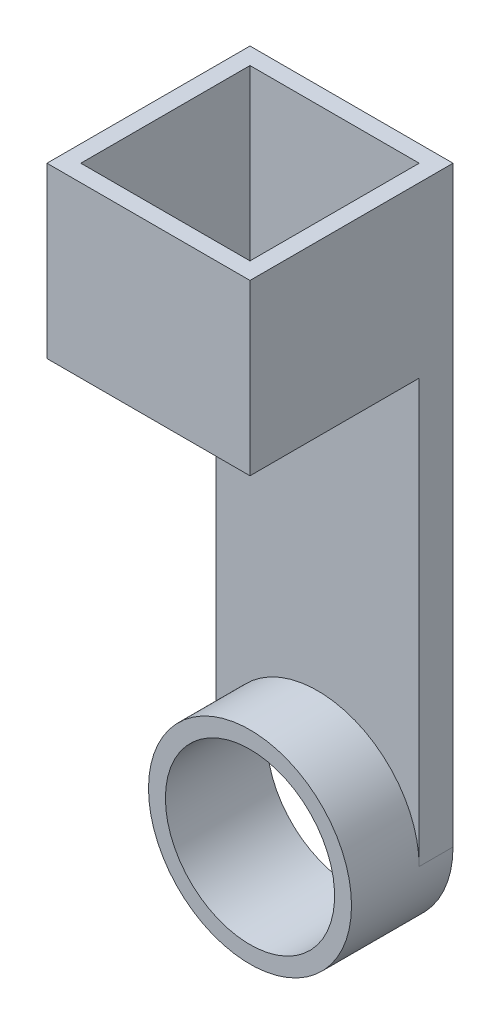
ISO-10303-21;
HEADER;
FILE_DESCRIPTION(('STEP AP214'),'2;1');
FILE_NAME('part.step','',(''),(''),'','','');
FILE_SCHEMA(('AUTOMOTIVE_DESIGN { 1 0 10303 214 1 1 1 1 }'));
ENDSEC;
DATA;
#1=APPLICATION_CONTEXT('core data for automotive mechanical design processes');
#2=APPLICATION_PROTOCOL_DEFINITION('international standard','automotive_design',2000,#1);
#3=PRODUCT_CONTEXT('',#1,'mechanical');
#4=PRODUCT('Part','Part','',(#3));
#5=PRODUCT_RELATED_PRODUCT_CATEGORY('part','',(#4));
#6=PRODUCT_DEFINITION_FORMATION('','',#4);
#7=PRODUCT_DEFINITION_CONTEXT('part definition',#1,'design');
#8=PRODUCT_DEFINITION('design','',#6,#7);
#9=PRODUCT_DEFINITION_SHAPE('','',#8);
#10=(LENGTH_UNIT() NAMED_UNIT(*) SI_UNIT(.MILLI.,.METRE.));
#11=(NAMED_UNIT(*) PLANE_ANGLE_UNIT() SI_UNIT($,.RADIAN.));
#12=(NAMED_UNIT(*) SI_UNIT($,.STERADIAN.) SOLID_ANGLE_UNIT());
#13=UNCERTAINTY_MEASURE_WITH_UNIT(LENGTH_MEASURE(1.E-05),#10,'distance_accuracy_value','');
#14=(GEOMETRIC_REPRESENTATION_CONTEXT(3) GLOBAL_UNCERTAINTY_ASSIGNED_CONTEXT((#13)) GLOBAL_UNIT_ASSIGNED_CONTEXT((#10,
#11,#12)) REPRESENTATION_CONTEXT('',''));
#15=CARTESIAN_POINT('',(0.,0.,0.));
#16=DIRECTION('',(0.,0.,1.));
#17=DIRECTION('',(1.,0.,0.));
#18=AXIS2_PLACEMENT_3D('',#15,#16,#17);
#19=CARTESIAN_POINT('',(0.,35.,0.));
#20=DIRECTION('',(0.,1.,0.));
#21=DIRECTION('',(0.,0.,1.));
#22=AXIS2_PLACEMENT_3D('',#19,#20,#21);
#23=PLANE('',#22);
#24=DIRECTION('',(0.,0.,1.));
#25=VECTOR('',#24,1.);
#26=CARTESIAN_POINT('',(-6.,35.,0.));
#27=LINE('',#26,#25);
#28=CARTESIAN_POINT('',(-6.,35.,0.));
#29=VERTEX_POINT('',#28);
#30=CARTESIAN_POINT('',(-6.,35.,12.));
#31=VERTEX_POINT('',#30);
#32=EDGE_CURVE('E159',#29,#31,#27,.T.);
#33=ORIENTED_EDGE('',*,*,#32,.T.);
#34=DIRECTION('',(1.,0.,0.));
#35=VECTOR('',#34,1.);
#36=CARTESIAN_POINT('',(-6.,35.,12.));
#37=LINE('',#36,#35);
#38=CARTESIAN_POINT('',(6.,35.,12.));
#39=VERTEX_POINT('',#38);
#40=EDGE_CURVE('E162',#31,#39,#37,.T.);
#41=ORIENTED_EDGE('',*,*,#40,.T.);
#42=DIRECTION('',(0.,0.,-1.));
#43=VECTOR('',#42,1.);
#44=CARTESIAN_POINT('',(6.,35.,0.));
#45=LINE('',#44,#43);
#46=CARTESIAN_POINT('',(6.,35.,0.));
#47=VERTEX_POINT('',#46);
#48=EDGE_CURVE('E165',#39,#47,#45,.T.);
#49=ORIENTED_EDGE('',*,*,#48,.T.);
#50=DIRECTION('',(-1.,0.,0.));
#51=VECTOR('',#50,1.);
#52=CARTESIAN_POINT('',(-6.,35.,0.));
#53=LINE('',#52,#51);
#54=EDGE_CURVE('E168',#47,#29,#53,.T.);
#55=ORIENTED_EDGE('',*,*,#54,.T.);
#56=EDGE_LOOP('',(#33,#41,#49,#55));
#57=FACE_BOUND('',#56,.T.);
#58=DIRECTION('',(0.,0.,-1.));
#59=VECTOR('',#58,1.);
#60=CARTESIAN_POINT('',(-5.00000000000002,35.,0.));
#61=LINE('',#60,#59);
#62=CARTESIAN_POINT('',(-5.00000000000002,35.,11.));
#63=VERTEX_POINT('',#62);
#64=CARTESIAN_POINT('',(-5.00000000000002,35.,0.999999999999982));
#65=VERTEX_POINT('',#64);
#66=EDGE_CURVE('E149',#63,#65,#61,.T.);
#67=ORIENTED_EDGE('',*,*,#66,.T.);
#68=DIRECTION('',(1.,0.,0.));
#69=VECTOR('',#68,1.);
#70=CARTESIAN_POINT('',(0.,35.,0.999999999999999));
#71=LINE('',#70,#69);
#72=CARTESIAN_POINT('',(5.00000000000002,35.,0.999999999999999));
#73=VERTEX_POINT('',#72);
#74=EDGE_CURVE('E50',#65,#73,#71,.T.);
#75=ORIENTED_EDGE('',*,*,#74,.T.);
#76=DIRECTION('',(0.,0.,-1.));
#77=VECTOR('',#76,1.);
#78=CARTESIAN_POINT('',(5.00000000000002,35.,0.));
#79=LINE('',#78,#77);
#80=CARTESIAN_POINT('',(5.,35.,11.));
#81=VERTEX_POINT('',#80);
#82=EDGE_CURVE('E139',#81,#73,#79,.T.);
#83=ORIENTED_EDGE('',*,*,#82,.F.);
#84=DIRECTION('',(1.,0.,0.));
#85=VECTOR('',#84,1.);
#86=CARTESIAN_POINT('',(0.,35.,11.));
#87=LINE('',#86,#85);
#88=EDGE_CURVE('E142',#63,#81,#87,.T.);
#89=ORIENTED_EDGE('',*,*,#88,.F.);
#90=EDGE_LOOP('',(#67,#75,#83,#89));
#91=FACE_BOUND('',#90,.T.);
#92=ADVANCED_FACE('F35',(#57,#91),#23,.T.);
#93=CARTESIAN_POINT('',(6.,0.,2.));
#94=DIRECTION('',(-1.,0.,0.));
#95=DIRECTION('',(0.,-1.,0.));
#96=AXIS2_PLACEMENT_3D('',#93,#94,#95);
#97=PLANE('',#96);
#98=DIRECTION('',(0.,1.,0.));
#99=VECTOR('',#98,1.);
#100=CARTESIAN_POINT('',(6.,0.,0.));
#101=LINE('',#100,#99);
#102=CARTESIAN_POINT('',(6.,0.,0.));
#103=VERTEX_POINT('',#102);
#104=EDGE_CURVE('E192',#103,#47,#101,.T.);
#105=ORIENTED_EDGE('',*,*,#104,.T.);
#106=ORIENTED_EDGE('',*,*,#48,.F.);
#107=DIRECTION('',(0.,-1.,0.));
#108=VECTOR('',#107,1.);
#109=CARTESIAN_POINT('',(6.,35.,12.));
#110=LINE('',#109,#108);
#111=CARTESIAN_POINT('',(6.,25.,12.));
#112=VERTEX_POINT('',#111);
#113=EDGE_CURVE('E171',#39,#112,#110,.T.);
#114=ORIENTED_EDGE('',*,*,#113,.T.);
#115=DIRECTION('',(0.,0.,-1.));
#116=VECTOR('',#115,1.);
#117=CARTESIAN_POINT('',(6.,25.,0.));
#118=LINE('',#117,#116);
#119=CARTESIAN_POINT('',(6.,25.,2.));
#120=VERTEX_POINT('',#119);
#121=EDGE_CURVE('E163',#112,#120,#118,.T.);
#122=ORIENTED_EDGE('',*,*,#121,.T.);
#123=DIRECTION('',(0.,1.,0.));
#124=VECTOR('',#123,1.);
#125=CARTESIAN_POINT('',(6.,0.,2.));
#126=LINE('',#125,#124);
#127=CARTESIAN_POINT('',(6.,0.,2.));
#128=VERTEX_POINT('',#127);
#129=EDGE_CURVE('E196',#128,#120,#126,.T.);
#130=ORIENTED_EDGE('',*,*,#129,.F.);
#131=DIRECTION('',(0.,0.,-1.));
#132=VECTOR('',#131,1.);
#133=CARTESIAN_POINT('',(6.,0.,2.));
#134=LINE('',#133,#132);
#135=EDGE_CURVE('E11',#128,#103,#134,.T.);
#136=ORIENTED_EDGE('',*,*,#135,.T.);
#137=EDGE_LOOP('',(#105,#106,#114,#122,#130,#136));
#138=FACE_BOUND('',#137,.T.);
#139=ADVANCED_FACE('F37',(#138),#97,.F.);
#140=CARTESIAN_POINT('',(-6.,0.,2.));
#141=DIRECTION('',(1.,0.,0.));
#142=DIRECTION('',(0.,1.,0.));
#143=AXIS2_PLACEMENT_3D('',#140,#141,#142);
#144=PLANE('',#143);
#145=DIRECTION('',(0.,-1.,0.));
#146=VECTOR('',#145,1.);
#147=CARTESIAN_POINT('',(-6.,0.,0.));
#148=LINE('',#147,#146);
#149=CARTESIAN_POINT('',(-6.,0.,0.));
#150=VERTEX_POINT('',#149);
#151=EDGE_CURVE('E197',#29,#150,#148,.T.);
#152=ORIENTED_EDGE('',*,*,#151,.T.);
#153=DIRECTION('',(0.,0.,-1.));
#154=VECTOR('',#153,1.);
#155=CARTESIAN_POINT('',(-6.,0.,2.));
#156=LINE('',#155,#154);
#157=CARTESIAN_POINT('',(-6.,0.,2.));
#158=VERTEX_POINT('',#157);
#159=EDGE_CURVE('E43',#158,#150,#156,.T.);
#160=ORIENTED_EDGE('',*,*,#159,.F.);
#161=DIRECTION('',(0.,-1.,0.));
#162=VECTOR('',#161,1.);
#163=CARTESIAN_POINT('',(-6.,0.,2.));
#164=LINE('',#163,#162);
#165=CARTESIAN_POINT('',(-6.,25.,2.));
#166=VERTEX_POINT('',#165);
#167=EDGE_CURVE('E204',#166,#158,#164,.T.);
#168=ORIENTED_EDGE('',*,*,#167,.F.);
#169=DIRECTION('',(0.,0.,1.));
#170=VECTOR('',#169,1.);
#171=CARTESIAN_POINT('',(-6.,25.,0.));
#172=LINE('',#171,#170);
#173=CARTESIAN_POINT('',(-6.,25.,12.));
#174=VERTEX_POINT('',#173);
#175=EDGE_CURVE('E155',#166,#174,#172,.T.);
#176=ORIENTED_EDGE('',*,*,#175,.T.);
#177=DIRECTION('',(0.,-1.,0.));
#178=VECTOR('',#177,1.);
#179=CARTESIAN_POINT('',(-6.,35.,12.));
#180=LINE('',#179,#178);
#181=EDGE_CURVE('E179',#31,#174,#180,.T.);
#182=ORIENTED_EDGE('',*,*,#181,.F.);
#183=ORIENTED_EDGE('',*,*,#32,.F.);
#184=EDGE_LOOP('',(#152,#160,#168,#176,#182,#183));
#185=FACE_BOUND('',#184,.T.);
#186=ADVANCED_FACE('F218',(#185),#144,.F.);
#187=CARTESIAN_POINT('',(0.,0.,2.));
#188=DIRECTION('',(0.,0.,1.));
#189=DIRECTION('',(1.,0.,0.));
#190=AXIS2_PLACEMENT_3D('',#187,#188,#189);
#191=PLANE('',#190);
#192=CARTESIAN_POINT('',(0.,0.,2.));
#193=DIRECTION('',(0.,0.,1.));
#194=DIRECTION('',(1.,0.,0.));
#195=AXIS2_PLACEMENT_3D('',#192,#193,#194);
#196=CIRCLE('',#195,6.);
#197=EDGE_CURVE('E194',#128,#158,#196,.T.);
#198=ORIENTED_EDGE('',*,*,#197,.F.);
#199=ORIENTED_EDGE('',*,*,#129,.T.);
#200=DIRECTION('',(-1.,0.,0.));
#201=VECTOR('',#200,1.);
#202=CARTESIAN_POINT('',(0.,25.,2.));
#203=LINE('',#202,#201);
#204=CARTESIAN_POINT('',(5.00000000000002,25.,2.));
#205=VERTEX_POINT('',#204);
#206=EDGE_CURVE('E201',#120,#205,#203,.T.);
#207=ORIENTED_EDGE('',*,*,#206,.T.);
#208=CARTESIAN_POINT('',(-5.00000000000002,25.,2.));
#209=VERTEX_POINT('',#208);
#210=EDGE_CURVE('E205',#205,#209,#203,.T.);
#211=ORIENTED_EDGE('',*,*,#210,.T.);
#212=EDGE_CURVE('E200',#209,#166,#203,.T.);
#213=ORIENTED_EDGE('',*,*,#212,.T.);
#214=ORIENTED_EDGE('',*,*,#167,.T.);
#215=EDGE_LOOP('',(#198,#199,#207,#211,#213,#214));
#216=FACE_BOUND('',#215,.T.);
#217=ADVANCED_FACE('F233',(#216),#191,.T.);
#218=CARTESIAN_POINT('',(0.,0.,0.));
#219=DIRECTION('',(0.,0.,1.));
#220=DIRECTION('',(1.,0.,0.));
#221=AXIS2_PLACEMENT_3D('',#218,#219,#220);
#222=PLANE('',#221);
#223=ORIENTED_EDGE('',*,*,#104,.F.);
#224=CARTESIAN_POINT('',(0.,0.,0.));
#225=DIRECTION('',(0.,0.,-1.));
#226=DIRECTION('',(-1.,0.,0.));
#227=AXIS2_PLACEMENT_3D('',#224,#225,#226);
#228=CIRCLE('',#227,6.);
#229=EDGE_CURVE('E186',#103,#150,#228,.T.);
#230=ORIENTED_EDGE('',*,*,#229,.T.);
#231=ORIENTED_EDGE('',*,*,#151,.F.);
#232=ORIENTED_EDGE('',*,*,#54,.F.);
#233=EDGE_LOOP('',(#223,#230,#231,#232));
#234=FACE_BOUND('',#233,.T.);
#235=CARTESIAN_POINT('',(0.,0.,0.));
#236=DIRECTION('',(0.,0.,-1.));
#237=DIRECTION('',(-1.,0.,0.));
#238=AXIS2_PLACEMENT_3D('',#235,#236,#237);
#239=CIRCLE('',#238,5.);
#240=CARTESIAN_POINT('',(-5.,0.,0.));
#241=VERTEX_POINT('',#240);
#242=EDGE_CURVE('E182',#241,#241,#239,.T.);
#243=ORIENTED_EDGE('',*,*,#242,.F.);
#244=EDGE_LOOP('',(#243));
#245=FACE_BOUND('',#244,.T.);
#246=ADVANCED_FACE('F223',(#234,#245),#222,.F.);
#247=CARTESIAN_POINT('',(0.,0.,6.));
#248=DIRECTION('',(0.,0.,-1.));
#249=DIRECTION('',(-1.,0.,0.));
#250=AXIS2_PLACEMENT_3D('',#247,#248,#249);
#251=CYLINDRICAL_SURFACE('',#250,6.);
#252=CARTESIAN_POINT('',(0.,0.,6.));
#253=DIRECTION('',(0.,0.,-1.));
#254=DIRECTION('',(-1.,0.,0.));
#255=AXIS2_PLACEMENT_3D('',#252,#253,#254);
#256=CIRCLE('',#255,6.);
#257=CARTESIAN_POINT('',(-6.,0.,6.));
#258=VERTEX_POINT('',#257);
#259=EDGE_CURVE('E189',#258,#258,#256,.T.);
#260=ORIENTED_EDGE('',*,*,#259,.T.);
#261=EDGE_LOOP('',(#260));
#262=FACE_BOUND('',#261,.T.);
#263=ORIENTED_EDGE('',*,*,#135,.F.);
#264=ORIENTED_EDGE('',*,*,#197,.T.);
#265=ORIENTED_EDGE('',*,*,#159,.T.);
#266=ORIENTED_EDGE('',*,*,#229,.F.);
#267=EDGE_LOOP('',(#263,#264,#265,#266));
#268=FACE_BOUND('',#267,.T.);
#269=ADVANCED_FACE('F213',(#262,#268),#251,.T.);
#270=CARTESIAN_POINT('',(0.,0.,6.));
#271=DIRECTION('',(0.,0.,-1.));
#272=DIRECTION('',(-1.,0.,0.));
#273=AXIS2_PLACEMENT_3D('',#270,#271,#272);
#274=PLANE('',#273);
#275=CARTESIAN_POINT('',(0.,0.,6.));
#276=DIRECTION('',(0.,0.,-1.));
#277=DIRECTION('',(-1.,0.,0.));
#278=AXIS2_PLACEMENT_3D('',#275,#276,#277);
#279=CIRCLE('',#278,5.);
#280=CARTESIAN_POINT('',(-5.,0.,6.));
#281=VERTEX_POINT('',#280);
#282=EDGE_CURVE('E183',#281,#281,#279,.T.);
#283=ORIENTED_EDGE('',*,*,#282,.T.);
#284=EDGE_LOOP('',(#283));
#285=FACE_BOUND('',#284,.T.);
#286=ORIENTED_EDGE('',*,*,#259,.F.);
#287=EDGE_LOOP('',(#286));
#288=FACE_BOUND('',#287,.T.);
#289=ADVANCED_FACE('F249',(#285,#288),#274,.F.);
#290=CARTESIAN_POINT('',(0.,0.,6.));
#291=DIRECTION('',(0.,0.,-1.));
#292=DIRECTION('',(-1.,0.,0.));
#293=AXIS2_PLACEMENT_3D('',#290,#291,#292);
#294=CYLINDRICAL_SURFACE('',#293,5.);
#295=ORIENTED_EDGE('',*,*,#282,.F.);
#296=EDGE_LOOP('',(#295));
#297=FACE_BOUND('',#296,.T.);
#298=ORIENTED_EDGE('',*,*,#242,.T.);
#299=EDGE_LOOP('',(#298));
#300=FACE_BOUND('',#299,.T.);
#301=ADVANCED_FACE('F242',(#297,#300),#294,.F.);
#302=CARTESIAN_POINT('',(-6.,35.,12.));
#303=DIRECTION('',(0.,0.,-1.));
#304=DIRECTION('',(-1.,0.,0.));
#305=AXIS2_PLACEMENT_3D('',#302,#303,#304);
#306=PLANE('',#305);
#307=DIRECTION('',(1.,0.,0.));
#308=VECTOR('',#307,1.);
#309=CARTESIAN_POINT('',(-6.,25.,12.));
#310=LINE('',#309,#308);
#311=EDGE_CURVE('E173',#174,#112,#310,.T.);
#312=ORIENTED_EDGE('',*,*,#311,.T.);
#313=ORIENTED_EDGE('',*,*,#113,.F.);
#314=ORIENTED_EDGE('',*,*,#40,.F.);
#315=ORIENTED_EDGE('',*,*,#181,.T.);
#316=EDGE_LOOP('',(#312,#313,#314,#315));
#317=FACE_BOUND('',#316,.T.);
#318=ADVANCED_FACE('F240',(#317),#306,.F.);
#319=CARTESIAN_POINT('',(0.,25.,0.));
#320=DIRECTION('',(0.,1.,0.));
#321=DIRECTION('',(0.,0.,1.));
#322=AXIS2_PLACEMENT_3D('',#319,#320,#321);
#323=PLANE('',#322);
#324=DIRECTION('',(1.,0.,0.));
#325=VECTOR('',#324,1.);
#326=CARTESIAN_POINT('',(0.,25.,11.));
#327=LINE('',#326,#325);
#328=CARTESIAN_POINT('',(-5.00000000000002,25.,11.));
#329=VERTEX_POINT('',#328);
#330=CARTESIAN_POINT('',(5.,25.,11.));
#331=VERTEX_POINT('',#330);
#332=EDGE_CURVE('E58',#329,#331,#327,.T.);
#333=ORIENTED_EDGE('',*,*,#332,.T.);
#334=DIRECTION('',(0.,0.,-1.));
#335=VECTOR('',#334,1.);
#336=CARTESIAN_POINT('',(5.00000000000002,25.,0.));
#337=LINE('',#336,#335);
#338=EDGE_CURVE('E134',#331,#205,#337,.T.);
#339=ORIENTED_EDGE('',*,*,#338,.T.);
#340=ORIENTED_EDGE('',*,*,#206,.F.);
#341=ORIENTED_EDGE('',*,*,#121,.F.);
#342=ORIENTED_EDGE('',*,*,#311,.F.);
#343=ORIENTED_EDGE('',*,*,#175,.F.);
#344=ORIENTED_EDGE('',*,*,#212,.F.);
#345=DIRECTION('',(0.,0.,-1.));
#346=VECTOR('',#345,1.);
#347=CARTESIAN_POINT('',(-5.00000000000002,25.,0.));
#348=LINE('',#347,#346);
#349=EDGE_CURVE('E124',#329,#209,#348,.T.);
#350=ORIENTED_EDGE('',*,*,#349,.F.);
#351=EDGE_LOOP('',(#333,#339,#340,#341,#342,#343,#344,#350));
#352=FACE_BOUND('',#351,.T.);
#353=ADVANCED_FACE('F238',(#352),#323,.F.);
#354=CARTESIAN_POINT('',(0.,25.,0.999999999999999));
#355=DIRECTION('',(0.,0.,1.));
#356=DIRECTION('',(1.,0.,0.));
#357=AXIS2_PLACEMENT_3D('',#354,#355,#356);
#358=PLANE('',#357);
#359=ORIENTED_EDGE('',*,*,#74,.F.);
#360=DIRECTION('',(0.,1.,0.));
#361=VECTOR('',#360,1.);
#362=CARTESIAN_POINT('',(-5.00000000000002,25.,0.999999999999982));
#363=LINE('',#362,#361);
#364=CARTESIAN_POINT('',(-5.00000000000002,25.,0.999999999999982));
#365=VERTEX_POINT('',#364);
#366=EDGE_CURVE('E121',#365,#65,#363,.T.);
#367=ORIENTED_EDGE('',*,*,#366,.F.);
#368=DIRECTION('',(1.,0.,0.));
#369=VECTOR('',#368,1.);
#370=CARTESIAN_POINT('',(0.,25.,0.999999999999999));
#371=LINE('',#370,#369);
#372=CARTESIAN_POINT('',(5.00000000000002,25.,0.999999999999999));
#373=VERTEX_POINT('',#372);
#374=EDGE_CURVE('E128',#365,#373,#371,.T.);
#375=ORIENTED_EDGE('',*,*,#374,.T.);
#376=DIRECTION('',(0.,1.,0.));
#377=VECTOR('',#376,1.);
#378=CARTESIAN_POINT('',(5.00000000000002,25.,0.999999999999999));
#379=LINE('',#378,#377);
#380=EDGE_CURVE('E153',#373,#73,#379,.T.);
#381=ORIENTED_EDGE('',*,*,#380,.T.);
#382=EDGE_LOOP('',(#359,#367,#375,#381));
#383=FACE_BOUND('',#382,.T.);
#384=ADVANCED_FACE('F131',(#383),#358,.T.);
#385=CARTESIAN_POINT('',(5.00000000000002,25.,0.));
#386=DIRECTION('',(1.,0.,0.));
#387=DIRECTION('',(0.,0.,-1.));
#388=AXIS2_PLACEMENT_3D('',#385,#386,#387);
#389=PLANE('',#388);
#390=ORIENTED_EDGE('',*,*,#82,.T.);
#391=ORIENTED_EDGE('',*,*,#380,.F.);
#392=EDGE_CURVE('E138',#205,#373,#337,.T.);
#393=ORIENTED_EDGE('',*,*,#392,.F.);
#394=ORIENTED_EDGE('',*,*,#338,.F.);
#395=DIRECTION('',(0.,1.,0.));
#396=VECTOR('',#395,1.);
#397=CARTESIAN_POINT('',(5.,25.,11.));
#398=LINE('',#397,#396);
#399=EDGE_CURVE('E156',#331,#81,#398,.T.);
#400=ORIENTED_EDGE('',*,*,#399,.T.);
#401=EDGE_LOOP('',(#390,#391,#393,#394,#400));
#402=FACE_BOUND('',#401,.T.);
#403=ADVANCED_FACE('F260',(#402),#389,.F.);
#404=CARTESIAN_POINT('',(0.,25.,11.));
#405=DIRECTION('',(0.,0.,1.));
#406=DIRECTION('',(1.,0.,0.));
#407=AXIS2_PLACEMENT_3D('',#404,#405,#406);
#408=PLANE('',#407);
#409=ORIENTED_EDGE('',*,*,#88,.T.);
#410=ORIENTED_EDGE('',*,*,#399,.F.);
#411=ORIENTED_EDGE('',*,*,#332,.F.);
#412=DIRECTION('',(0.,1.,0.));
#413=VECTOR('',#412,1.);
#414=CARTESIAN_POINT('',(-5.00000000000002,25.,11.));
#415=LINE('',#414,#413);
#416=EDGE_CURVE('E133',#329,#63,#415,.T.);
#417=ORIENTED_EDGE('',*,*,#416,.T.);
#418=EDGE_LOOP('',(#409,#410,#411,#417));
#419=FACE_BOUND('',#418,.T.);
#420=ADVANCED_FACE('F263',(#419),#408,.F.);
#421=CARTESIAN_POINT('',(-5.00000000000002,25.,0.));
#422=DIRECTION('',(1.,0.,0.));
#423=DIRECTION('',(0.,0.,-1.));
#424=AXIS2_PLACEMENT_3D('',#421,#422,#423);
#425=PLANE('',#424);
#426=ORIENTED_EDGE('',*,*,#66,.F.);
#427=ORIENTED_EDGE('',*,*,#416,.F.);
#428=ORIENTED_EDGE('',*,*,#349,.T.);
#429=EDGE_CURVE('E118',#209,#365,#348,.T.);
#430=ORIENTED_EDGE('',*,*,#429,.T.);
#431=ORIENTED_EDGE('',*,*,#366,.T.);
#432=EDGE_LOOP('',(#426,#427,#428,#430,#431));
#433=FACE_BOUND('',#432,.T.);
#434=ADVANCED_FACE('F120',(#433),#425,.T.);
#435=CARTESIAN_POINT('',(0.,25.,0.));
#436=DIRECTION('',(0.,1.,0.));
#437=DIRECTION('',(0.,0.,1.));
#438=AXIS2_PLACEMENT_3D('',#435,#436,#437);
#439=PLANE('',#438);
#440=ORIENTED_EDGE('',*,*,#392,.T.);
#441=ORIENTED_EDGE('',*,*,#374,.F.);
#442=ORIENTED_EDGE('',*,*,#429,.F.);
#443=ORIENTED_EDGE('',*,*,#210,.F.);
#444=EDGE_LOOP('',(#440,#441,#442,#443));
#445=FACE_BOUND('',#444,.T.);
#446=ADVANCED_FACE('F136',(#445),#439,.T.);
#447=CLOSED_SHELL('',(#92,#139,#186,#217,#246,#269,#289,#301,#318,#353,#384,#403,#420,#434,#446));
#448=MANIFOLD_SOLID_BREP('B2',#447);
#449=ADVANCED_BREP_SHAPE_REPRESENTATION('',(#18,#448),#14);
#450=SHAPE_DEFINITION_REPRESENTATION(#9,#449);
ENDSEC;
END-ISO-10303-21;
